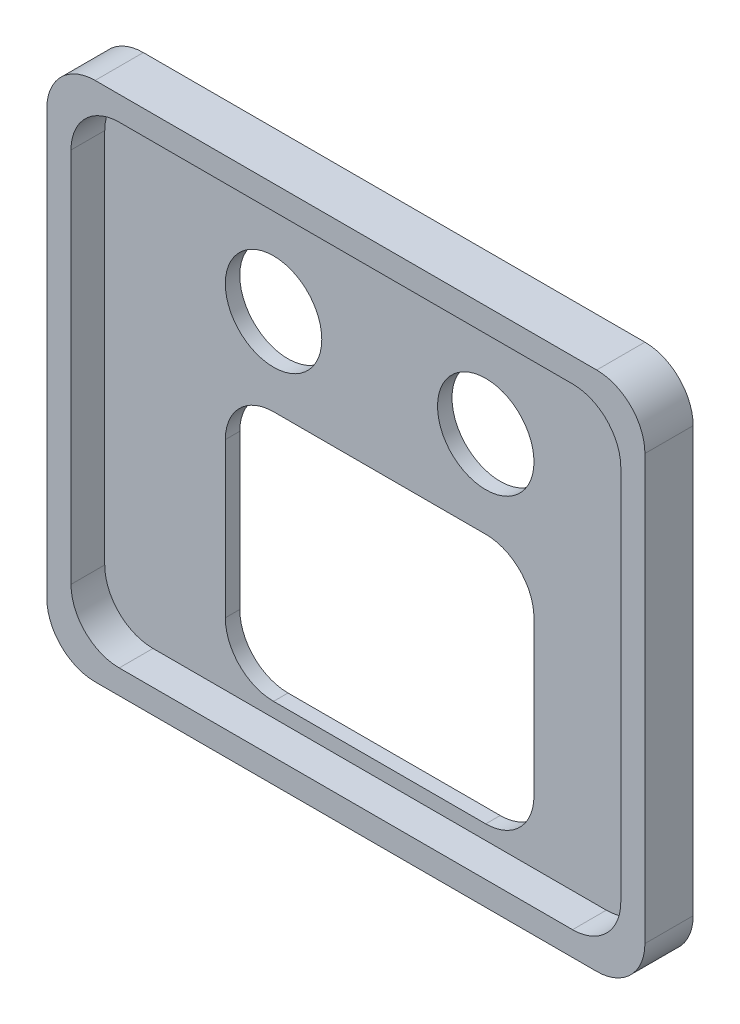
ISO-10303-21;
HEADER;
FILE_DESCRIPTION(('STEP AP214'),'2;1');
FILE_NAME('part.step','',(''),(''),'','','');
FILE_SCHEMA(('AUTOMOTIVE_DESIGN { 1 0 10303 214 1 1 1 1 }'));
ENDSEC;
DATA;
#1=APPLICATION_CONTEXT('core data for automotive mechanical design processes');
#2=APPLICATION_PROTOCOL_DEFINITION('international standard','automotive_design',2000,#1);
#3=PRODUCT_CONTEXT('',#1,'mechanical');
#4=PRODUCT('Part','Part','',(#3));
#5=PRODUCT_RELATED_PRODUCT_CATEGORY('part','',(#4));
#6=PRODUCT_DEFINITION_FORMATION('','',#4);
#7=PRODUCT_DEFINITION_CONTEXT('part definition',#1,'design');
#8=PRODUCT_DEFINITION('design','',#6,#7);
#9=PRODUCT_DEFINITION_SHAPE('','',#8);
#10=(LENGTH_UNIT() NAMED_UNIT(*) SI_UNIT(.MILLI.,.METRE.));
#11=(NAMED_UNIT(*) PLANE_ANGLE_UNIT() SI_UNIT($,.RADIAN.));
#12=(NAMED_UNIT(*) SI_UNIT($,.STERADIAN.) SOLID_ANGLE_UNIT());
#13=UNCERTAINTY_MEASURE_WITH_UNIT(LENGTH_MEASURE(1.E-05),#10,'distance_accuracy_value','');
#14=(GEOMETRIC_REPRESENTATION_CONTEXT(3) GLOBAL_UNCERTAINTY_ASSIGNED_CONTEXT((#13)) GLOBAL_UNIT_ASSIGNED_CONTEXT((#10,
#11,#12)) REPRESENTATION_CONTEXT('',''));
#15=CARTESIAN_POINT('',(0.,0.,0.));
#16=DIRECTION('',(0.,0.,1.));
#17=DIRECTION('',(1.,0.,0.));
#18=AXIS2_PLACEMENT_3D('',#15,#16,#17);
#19=CARTESIAN_POINT('',(10.,10.,10.));
#20=DIRECTION('',(0.,0.,-1.));
#21=DIRECTION('',(-1.,0.,0.));
#22=AXIS2_PLACEMENT_3D('',#19,#20,#21);
#23=CYLINDRICAL_SURFACE('',#22,10.);
#24=CARTESIAN_POINT('',(10.,10.,0.));
#25=DIRECTION('',(0.,0.,1.));
#26=DIRECTION('',(1.,0.,0.));
#27=AXIS2_PLACEMENT_3D('',#24,#25,#26);
#28=CIRCLE('',#27,10.);
#29=CARTESIAN_POINT('',(0.,10.0000000000001,0.));
#30=VERTEX_POINT('',#29);
#31=CARTESIAN_POINT('',(10.0000000000001,0.,0.));
#32=VERTEX_POINT('',#31);
#33=EDGE_CURVE('E302',#30,#32,#28,.T.);
#34=ORIENTED_EDGE('',*,*,#33,.T.);
#35=DIRECTION('',(0.,0.,-1.));
#36=VECTOR('',#35,1.);
#37=CARTESIAN_POINT('',(10.0000000000001,0.,10.));
#38=LINE('',#37,#36);
#39=CARTESIAN_POINT('',(10.0000000000001,0.,10.));
#40=VERTEX_POINT('',#39);
#41=EDGE_CURVE('E367',#40,#32,#38,.T.);
#42=ORIENTED_EDGE('',*,*,#41,.F.);
#43=CARTESIAN_POINT('',(10.,10.,10.));
#44=DIRECTION('',(0.,0.,1.));
#45=DIRECTION('',(1.,0.,0.));
#46=AXIS2_PLACEMENT_3D('',#43,#44,#45);
#47=CIRCLE('',#46,10.);
#48=CARTESIAN_POINT('',(0.,10.0000000000001,10.));
#49=VERTEX_POINT('',#48);
#50=EDGE_CURVE('E316',#49,#40,#47,.T.);
#51=ORIENTED_EDGE('',*,*,#50,.F.);
#52=DIRECTION('',(0.,0.,-1.));
#53=VECTOR('',#52,1.);
#54=CARTESIAN_POINT('',(0.,10.0000000000001,10.));
#55=LINE('',#54,#53);
#56=EDGE_CURVE('E331',#49,#30,#55,.T.);
#57=ORIENTED_EDGE('',*,*,#56,.T.);
#58=EDGE_LOOP('',(#34,#42,#51,#57));
#59=FACE_BOUND('',#58,.T.);
#60=ADVANCED_FACE('F41',(#59),#23,.T.);
#61=CARTESIAN_POINT('',(10.0000000000001,0.,10.));
#62=DIRECTION('',(0.,1.,0.));
#63=DIRECTION('',(0.,0.,1.));
#64=AXIS2_PLACEMENT_3D('',#61,#62,#63);
#65=PLANE('',#64);
#66=DIRECTION('',(1.,0.,0.));
#67=VECTOR('',#66,1.);
#68=CARTESIAN_POINT('',(10.0000000000001,0.,0.));
#69=LINE('',#68,#67);
#70=CARTESIAN_POINT('',(114.,0.,0.));
#71=VERTEX_POINT('',#70);
#72=EDGE_CURVE('E337',#32,#71,#69,.T.);
#73=ORIENTED_EDGE('',*,*,#72,.T.);
#74=DIRECTION('',(0.,0.,-1.));
#75=VECTOR('',#74,1.);
#76=CARTESIAN_POINT('',(114.,0.,10.));
#77=LINE('',#76,#75);
#78=CARTESIAN_POINT('',(114.,0.,10.));
#79=VERTEX_POINT('',#78);
#80=EDGE_CURVE('E370',#79,#71,#77,.T.);
#81=ORIENTED_EDGE('',*,*,#80,.F.);
#82=DIRECTION('',(1.,0.,0.));
#83=VECTOR('',#82,1.);
#84=CARTESIAN_POINT('',(10.0000000000001,0.,10.));
#85=LINE('',#84,#83);
#86=EDGE_CURVE('E317',#40,#79,#85,.T.);
#87=ORIENTED_EDGE('',*,*,#86,.F.);
#88=ORIENTED_EDGE('',*,*,#41,.T.);
#89=EDGE_LOOP('',(#73,#81,#87,#88));
#90=FACE_BOUND('',#89,.T.);
#91=ADVANCED_FACE('F419',(#90),#65,.F.);
#92=CARTESIAN_POINT('',(114.,10.,10.));
#93=DIRECTION('',(0.,0.,-1.));
#94=DIRECTION('',(-1.,0.,0.));
#95=AXIS2_PLACEMENT_3D('',#92,#93,#94);
#96=CYLINDRICAL_SURFACE('',#95,10.);
#97=CARTESIAN_POINT('',(114.,10.,0.));
#98=DIRECTION('',(0.,0.,1.));
#99=DIRECTION('',(-1.,0.,0.));
#100=AXIS2_PLACEMENT_3D('',#97,#98,#99);
#101=CIRCLE('',#100,10.);
#102=CARTESIAN_POINT('',(124.,10.0000000000001,0.));
#103=VERTEX_POINT('',#102);
#104=EDGE_CURVE('E338',#71,#103,#101,.T.);
#105=ORIENTED_EDGE('',*,*,#104,.T.);
#106=DIRECTION('',(0.,0.,-1.));
#107=VECTOR('',#106,1.);
#108=CARTESIAN_POINT('',(124.,10.0000000000001,10.));
#109=LINE('',#108,#107);
#110=CARTESIAN_POINT('',(124.,10.0000000000001,10.));
#111=VERTEX_POINT('',#110);
#112=EDGE_CURVE('E365',#111,#103,#109,.T.);
#113=ORIENTED_EDGE('',*,*,#112,.F.);
#114=CARTESIAN_POINT('',(114.,10.,10.));
#115=DIRECTION('',(0.,0.,1.));
#116=DIRECTION('',(-1.,0.,0.));
#117=AXIS2_PLACEMENT_3D('',#114,#115,#116);
#118=CIRCLE('',#117,10.);
#119=EDGE_CURVE('E325',#79,#111,#118,.T.);
#120=ORIENTED_EDGE('',*,*,#119,.F.);
#121=ORIENTED_EDGE('',*,*,#80,.T.);
#122=EDGE_LOOP('',(#105,#113,#120,#121));
#123=FACE_BOUND('',#122,.T.);
#124=ADVANCED_FACE('F422',(#123),#96,.T.);
#125=CARTESIAN_POINT('',(124.,97.9999999999999,10.));
#126=DIRECTION('',(-1.,0.,0.));
#127=DIRECTION('',(0.,-1.,0.));
#128=AXIS2_PLACEMENT_3D('',#125,#126,#127);
#129=PLANE('',#128);
#130=DIRECTION('',(0.,1.,0.));
#131=VECTOR('',#130,1.);
#132=CARTESIAN_POINT('',(124.,97.9999999999999,0.));
#133=LINE('',#132,#131);
#134=CARTESIAN_POINT('',(124.,97.9999999999999,0.));
#135=VERTEX_POINT('',#134);
#136=EDGE_CURVE('E342',#103,#135,#133,.T.);
#137=ORIENTED_EDGE('',*,*,#136,.T.);
#138=DIRECTION('',(0.,0.,-1.));
#139=VECTOR('',#138,1.);
#140=CARTESIAN_POINT('',(124.,97.9999999999999,10.));
#141=LINE('',#140,#139);
#142=CARTESIAN_POINT('',(124.,97.9999999999999,10.));
#143=VERTEX_POINT('',#142);
#144=EDGE_CURVE('E363',#143,#135,#141,.T.);
#145=ORIENTED_EDGE('',*,*,#144,.F.);
#146=DIRECTION('',(0.,1.,0.));
#147=VECTOR('',#146,1.);
#148=CARTESIAN_POINT('',(124.,97.9999999999999,10.));
#149=LINE('',#148,#147);
#150=EDGE_CURVE('E322',#111,#143,#149,.T.);
#151=ORIENTED_EDGE('',*,*,#150,.F.);
#152=ORIENTED_EDGE('',*,*,#112,.T.);
#153=EDGE_LOOP('',(#137,#145,#151,#152));
#154=FACE_BOUND('',#153,.T.);
#155=ADVANCED_FACE('F460',(#154),#129,.F.);
#156=CARTESIAN_POINT('',(114.,98.,10.));
#157=DIRECTION('',(0.,0.,-1.));
#158=DIRECTION('',(-1.,0.,0.));
#159=AXIS2_PLACEMENT_3D('',#156,#157,#158);
#160=CYLINDRICAL_SURFACE('',#159,9.99999999999999);
#161=CARTESIAN_POINT('',(114.,98.,0.));
#162=DIRECTION('',(0.,0.,1.));
#163=DIRECTION('',(-1.,0.,0.));
#164=AXIS2_PLACEMENT_3D('',#161,#162,#163);
#165=CIRCLE('',#164,9.99999999999999);
#166=CARTESIAN_POINT('',(114.,108.,0.));
#167=VERTEX_POINT('',#166);
#168=EDGE_CURVE('E344',#135,#167,#165,.T.);
#169=ORIENTED_EDGE('',*,*,#168,.T.);
#170=DIRECTION('',(0.,0.,-1.));
#171=VECTOR('',#170,1.);
#172=CARTESIAN_POINT('',(114.,108.,10.));
#173=LINE('',#172,#171);
#174=CARTESIAN_POINT('',(114.,108.,10.));
#175=VERTEX_POINT('',#174);
#176=EDGE_CURVE('E359',#175,#167,#173,.T.);
#177=ORIENTED_EDGE('',*,*,#176,.F.);
#178=CARTESIAN_POINT('',(114.,98.,10.));
#179=DIRECTION('',(0.,0.,1.));
#180=DIRECTION('',(-1.,0.,0.));
#181=AXIS2_PLACEMENT_3D('',#178,#179,#180);
#182=CIRCLE('',#181,9.99999999999999);
#183=EDGE_CURVE('E326',#143,#175,#182,.T.);
#184=ORIENTED_EDGE('',*,*,#183,.F.);
#185=ORIENTED_EDGE('',*,*,#144,.T.);
#186=EDGE_LOOP('',(#169,#177,#184,#185));
#187=FACE_BOUND('',#186,.T.);
#188=ADVANCED_FACE('F454',(#187),#160,.T.);
#189=CARTESIAN_POINT('',(10.0000000000001,108.,10.));
#190=DIRECTION('',(0.,-1.,0.));
#191=DIRECTION('',(0.,0.,-1.));
#192=AXIS2_PLACEMENT_3D('',#189,#190,#191);
#193=PLANE('',#192);
#194=DIRECTION('',(-1.,0.,0.));
#195=VECTOR('',#194,1.);
#196=CARTESIAN_POINT('',(10.0000000000001,108.,0.));
#197=LINE('',#196,#195);
#198=CARTESIAN_POINT('',(10.0000000000001,108.,0.));
#199=VERTEX_POINT('',#198);
#200=EDGE_CURVE('E343',#167,#199,#197,.T.);
#201=ORIENTED_EDGE('',*,*,#200,.T.);
#202=DIRECTION('',(0.,0.,-1.));
#203=VECTOR('',#202,1.);
#204=CARTESIAN_POINT('',(10.0000000000001,108.,10.));
#205=LINE('',#204,#203);
#206=CARTESIAN_POINT('',(10.0000000000001,108.,10.));
#207=VERTEX_POINT('',#206);
#208=EDGE_CURVE('E355',#207,#199,#205,.T.);
#209=ORIENTED_EDGE('',*,*,#208,.F.);
#210=DIRECTION('',(-1.,0.,0.));
#211=VECTOR('',#210,1.);
#212=CARTESIAN_POINT('',(10.0000000000001,108.,10.));
#213=LINE('',#212,#211);
#214=EDGE_CURVE('E327',#175,#207,#213,.T.);
#215=ORIENTED_EDGE('',*,*,#214,.F.);
#216=ORIENTED_EDGE('',*,*,#176,.T.);
#217=EDGE_LOOP('',(#201,#209,#215,#216));
#218=FACE_BOUND('',#217,.T.);
#219=ADVANCED_FACE('F449',(#218),#193,.F.);
#220=CARTESIAN_POINT('',(9.99999999999998,98.,10.));
#221=DIRECTION('',(0.,0.,-1.));
#222=DIRECTION('',(-1.,0.,0.));
#223=AXIS2_PLACEMENT_3D('',#220,#221,#222);
#224=CYLINDRICAL_SURFACE('',#223,9.99999999999999);
#225=CARTESIAN_POINT('',(9.99999999999998,98.,0.));
#226=DIRECTION('',(0.,0.,1.));
#227=DIRECTION('',(1.,0.,0.));
#228=AXIS2_PLACEMENT_3D('',#225,#226,#227);
#229=CIRCLE('',#228,9.99999999999999);
#230=CARTESIAN_POINT('',(0.,97.9999999999999,0.));
#231=VERTEX_POINT('',#230);
#232=EDGE_CURVE('E350',#199,#231,#229,.T.);
#233=ORIENTED_EDGE('',*,*,#232,.T.);
#234=DIRECTION('',(0.,0.,-1.));
#235=VECTOR('',#234,1.);
#236=CARTESIAN_POINT('',(0.,97.9999999999999,10.));
#237=LINE('',#236,#235);
#238=CARTESIAN_POINT('',(0.,97.9999999999999,10.));
#239=VERTEX_POINT('',#238);
#240=EDGE_CURVE('E352',#239,#231,#237,.T.);
#241=ORIENTED_EDGE('',*,*,#240,.F.);
#242=CARTESIAN_POINT('',(9.99999999999998,98.,10.));
#243=DIRECTION('',(0.,0.,1.));
#244=DIRECTION('',(1.,0.,0.));
#245=AXIS2_PLACEMENT_3D('',#242,#243,#244);
#246=CIRCLE('',#245,9.99999999999999);
#247=EDGE_CURVE('E329',#207,#239,#246,.T.);
#248=ORIENTED_EDGE('',*,*,#247,.F.);
#249=ORIENTED_EDGE('',*,*,#208,.T.);
#250=EDGE_LOOP('',(#233,#241,#248,#249));
#251=FACE_BOUND('',#250,.T.);
#252=ADVANCED_FACE('F444',(#251),#224,.T.);
#253=CARTESIAN_POINT('',(0.,97.9999999999999,10.));
#254=DIRECTION('',(1.,0.,0.));
#255=DIRECTION('',(0.,1.,0.));
#256=AXIS2_PLACEMENT_3D('',#253,#254,#255);
#257=PLANE('',#256);
#258=DIRECTION('',(0.,-1.,0.));
#259=VECTOR('',#258,1.);
#260=CARTESIAN_POINT('',(0.,97.9999999999999,0.));
#261=LINE('',#260,#259);
#262=EDGE_CURVE('E319',#231,#30,#261,.T.);
#263=ORIENTED_EDGE('',*,*,#262,.T.);
#264=ORIENTED_EDGE('',*,*,#56,.F.);
#265=DIRECTION('',(0.,-1.,0.));
#266=VECTOR('',#265,1.);
#267=CARTESIAN_POINT('',(0.,97.9999999999999,10.));
#268=LINE('',#267,#266);
#269=EDGE_CURVE('E335',#239,#49,#268,.T.);
#270=ORIENTED_EDGE('',*,*,#269,.F.);
#271=ORIENTED_EDGE('',*,*,#240,.T.);
#272=EDGE_LOOP('',(#263,#264,#270,#271));
#273=FACE_BOUND('',#272,.T.);
#274=ADVANCED_FACE('F413',(#273),#257,.F.);
#275=CARTESIAN_POINT('',(10.,10.,10.));
#276=DIRECTION('',(0.,0.,1.));
#277=DIRECTION('',(1.,0.,0.));
#278=AXIS2_PLACEMENT_3D('',#275,#276,#277);
#279=PLANE('',#278);
#280=CARTESIAN_POINT('',(15.,15.,10.));
#281=DIRECTION('',(0.,0.,1.));
#282=DIRECTION('',(1.,0.,0.));
#283=AXIS2_PLACEMENT_3D('',#280,#281,#282);
#284=CIRCLE('',#283,10.);
#285=CARTESIAN_POINT('',(5.,15.0000000000001,10.));
#286=VERTEX_POINT('',#285);
#287=CARTESIAN_POINT('',(15.0000000000001,5.,10.));
#288=VERTEX_POINT('',#287);
#289=EDGE_CURVE('E241',#286,#288,#284,.T.);
#290=ORIENTED_EDGE('',*,*,#289,.F.);
#291=DIRECTION('',(0.,-1.,0.));
#292=VECTOR('',#291,1.);
#293=CARTESIAN_POINT('',(4.99999999999999,92.9999999999999,10.));
#294=LINE('',#293,#292);
#295=CARTESIAN_POINT('',(4.99999999999999,92.9999999999999,10.));
#296=VERTEX_POINT('',#295);
#297=EDGE_CURVE('E258',#296,#286,#294,.T.);
#298=ORIENTED_EDGE('',*,*,#297,.F.);
#299=CARTESIAN_POINT('',(15.,93.,10.));
#300=DIRECTION('',(0.,0.,1.));
#301=DIRECTION('',(1.,0.,0.));
#302=AXIS2_PLACEMENT_3D('',#299,#300,#301);
#303=CIRCLE('',#302,9.99999999999999);
#304=CARTESIAN_POINT('',(15.0000000000001,103.,10.));
#305=VERTEX_POINT('',#304);
#306=EDGE_CURVE('E294',#305,#296,#303,.T.);
#307=ORIENTED_EDGE('',*,*,#306,.F.);
#308=DIRECTION('',(-1.,0.,0.));
#309=VECTOR('',#308,1.);
#310=CARTESIAN_POINT('',(15.0000000000001,103.,10.));
#311=LINE('',#310,#309);
#312=CARTESIAN_POINT('',(109.,103.,10.));
#313=VERTEX_POINT('',#312);
#314=EDGE_CURVE('E292',#313,#305,#311,.T.);
#315=ORIENTED_EDGE('',*,*,#314,.F.);
#316=CARTESIAN_POINT('',(109.,93.,10.));
#317=DIRECTION('',(0.,0.,1.));
#318=DIRECTION('',(1.,0.,0.));
#319=AXIS2_PLACEMENT_3D('',#316,#317,#318);
#320=CIRCLE('',#319,9.99999999999999);
#321=CARTESIAN_POINT('',(119.,92.9999999999999,10.));
#322=VERTEX_POINT('',#321);
#323=EDGE_CURVE('E289',#322,#313,#320,.T.);
#324=ORIENTED_EDGE('',*,*,#323,.F.);
#325=DIRECTION('',(0.,1.,0.));
#326=VECTOR('',#325,1.);
#327=CARTESIAN_POINT('',(119.,92.9999999999999,10.));
#328=LINE('',#327,#326);
#329=CARTESIAN_POINT('',(119.,15.0000000000001,10.));
#330=VERTEX_POINT('',#329);
#331=EDGE_CURVE('E285',#330,#322,#328,.T.);
#332=ORIENTED_EDGE('',*,*,#331,.F.);
#333=CARTESIAN_POINT('',(109.,15.,10.));
#334=DIRECTION('',(0.,0.,1.));
#335=DIRECTION('',(1.,0.,0.));
#336=AXIS2_PLACEMENT_3D('',#333,#334,#335);
#337=CIRCLE('',#336,10.);
#338=CARTESIAN_POINT('',(109.,5.,10.));
#339=VERTEX_POINT('',#338);
#340=EDGE_CURVE('E282',#339,#330,#337,.T.);
#341=ORIENTED_EDGE('',*,*,#340,.F.);
#342=DIRECTION('',(1.,0.,0.));
#343=VECTOR('',#342,1.);
#344=CARTESIAN_POINT('',(15.0000000000001,5.,10.));
#345=LINE('',#344,#343);
#346=EDGE_CURVE('E276',#288,#339,#345,.T.);
#347=ORIENTED_EDGE('',*,*,#346,.F.);
#348=EDGE_LOOP('',(#290,#298,#307,#315,#324,#332,#341,#347));
#349=FACE_BOUND('',#348,.T.);
#350=ORIENTED_EDGE('',*,*,#50,.T.);
#351=ORIENTED_EDGE('',*,*,#86,.T.);
#352=ORIENTED_EDGE('',*,*,#119,.T.);
#353=ORIENTED_EDGE('',*,*,#150,.T.);
#354=ORIENTED_EDGE('',*,*,#183,.T.);
#355=ORIENTED_EDGE('',*,*,#214,.T.);
#356=ORIENTED_EDGE('',*,*,#247,.T.);
#357=ORIENTED_EDGE('',*,*,#269,.T.);
#358=EDGE_LOOP('',(#350,#351,#352,#353,#354,#355,#356,#357));
#359=FACE_BOUND('',#358,.T.);
#360=ADVANCED_FACE('F401',(#349,#359),#279,.T.);
#361=CARTESIAN_POINT('',(10.,10.,0.));
#362=DIRECTION('',(0.,0.,1.));
#363=DIRECTION('',(1.,0.,0.));
#364=AXIS2_PLACEMENT_3D('',#361,#362,#363);
#365=PLANE('',#364);
#366=CARTESIAN_POINT('',(84.,78.,0.));
#367=DIRECTION('',(0.,0.,-1.));
#368=DIRECTION('',(-1.,0.,0.));
#369=AXIS2_PLACEMENT_3D('',#366,#367,#368);
#370=CIRCLE('',#369,9.99999999999999);
#371=CARTESIAN_POINT('',(74.,78.,0.));
#372=VERTEX_POINT('',#371);
#373=EDGE_CURVE('E387',#372,#372,#370,.T.);
#374=ORIENTED_EDGE('',*,*,#373,.F.);
#375=EDGE_LOOP('',(#374));
#376=FACE_BOUND('',#375,.T.);
#377=CARTESIAN_POINT('',(40.,78.,0.));
#378=DIRECTION('',(0.,0.,-1.));
#379=DIRECTION('',(-1.,0.,0.));
#380=AXIS2_PLACEMENT_3D('',#377,#378,#379);
#381=CIRCLE('',#380,9.99999999999999);
#382=CARTESIAN_POINT('',(30.,78.,0.));
#383=VERTEX_POINT('',#382);
#384=EDGE_CURVE('E391',#383,#383,#381,.T.);
#385=ORIENTED_EDGE('',*,*,#384,.F.);
#386=EDGE_LOOP('',(#385));
#387=FACE_BOUND('',#386,.T.);
#388=DIRECTION('',(-1.,0.,0.));
#389=VECTOR('',#388,1.);
#390=CARTESIAN_POINT('',(83.9999999999999,8.,0.));
#391=LINE('',#390,#389);
#392=CARTESIAN_POINT('',(83.9999999999999,8.,0.));
#393=VERTEX_POINT('',#392);
#394=CARTESIAN_POINT('',(40.,8.,0.));
#395=VERTEX_POINT('',#394);
#396=EDGE_CURVE('E212',#393,#395,#391,.T.);
#397=ORIENTED_EDGE('',*,*,#396,.F.);
#398=CARTESIAN_POINT('',(84.,18.,0.));
#399=DIRECTION('',(0.,0.,-1.));
#400=DIRECTION('',(1.,0.,0.));
#401=AXIS2_PLACEMENT_3D('',#398,#399,#400);
#402=CIRCLE('',#401,10.);
#403=CARTESIAN_POINT('',(94.,18.0000000000001,0.));
#404=VERTEX_POINT('',#403);
#405=EDGE_CURVE('E60',#404,#393,#402,.T.);
#406=ORIENTED_EDGE('',*,*,#405,.F.);
#407=DIRECTION('',(0.,-1.,0.));
#408=VECTOR('',#407,1.);
#409=CARTESIAN_POINT('',(94.,49.9999999999999,0.));
#410=LINE('',#409,#408);
#411=CARTESIAN_POINT('',(94.,49.9999999999999,0.));
#412=VERTEX_POINT('',#411);
#413=EDGE_CURVE('E237',#412,#404,#410,.T.);
#414=ORIENTED_EDGE('',*,*,#413,.F.);
#415=CARTESIAN_POINT('',(84.,50.,0.));
#416=DIRECTION('',(0.,0.,-1.));
#417=DIRECTION('',(-1.,0.,0.));
#418=AXIS2_PLACEMENT_3D('',#415,#416,#417);
#419=CIRCLE('',#418,9.99999999999999);
#420=CARTESIAN_POINT('',(83.9999999999999,60.,0.));
#421=VERTEX_POINT('',#420);
#422=EDGE_CURVE('E234',#421,#412,#419,.T.);
#423=ORIENTED_EDGE('',*,*,#422,.F.);
#424=DIRECTION('',(1.,0.,0.));
#425=VECTOR('',#424,1.);
#426=CARTESIAN_POINT('',(83.9999999999999,60.,0.));
#427=LINE('',#426,#425);
#428=CARTESIAN_POINT('',(40.0000000000001,60.,0.));
#429=VERTEX_POINT('',#428);
#430=EDGE_CURVE('E230',#429,#421,#427,.T.);
#431=ORIENTED_EDGE('',*,*,#430,.F.);
#432=CARTESIAN_POINT('',(40.,50.,0.));
#433=DIRECTION('',(0.,0.,-1.));
#434=DIRECTION('',(-1.,0.,0.));
#435=AXIS2_PLACEMENT_3D('',#432,#433,#434);
#436=CIRCLE('',#435,10.);
#437=CARTESIAN_POINT('',(30.,49.9999999999999,0.));
#438=VERTEX_POINT('',#437);
#439=EDGE_CURVE('E221',#438,#429,#436,.T.);
#440=ORIENTED_EDGE('',*,*,#439,.F.);
#441=DIRECTION('',(0.,1.,0.));
#442=VECTOR('',#441,1.);
#443=CARTESIAN_POINT('',(30.,49.9999999999999,0.));
#444=LINE('',#443,#442);
#445=CARTESIAN_POINT('',(30.,18.0000000000001,0.));
#446=VERTEX_POINT('',#445);
#447=EDGE_CURVE('E225',#446,#438,#444,.T.);
#448=ORIENTED_EDGE('',*,*,#447,.F.);
#449=CARTESIAN_POINT('',(40.,18.,0.));
#450=DIRECTION('',(0.,0.,-1.));
#451=DIRECTION('',(1.,0.,0.));
#452=AXIS2_PLACEMENT_3D('',#449,#450,#451);
#453=CIRCLE('',#452,10.);
#454=EDGE_CURVE('E202',#395,#446,#453,.T.);
#455=ORIENTED_EDGE('',*,*,#454,.F.);
#456=EDGE_LOOP('',(#397,#406,#414,#423,#431,#440,#448,#455));
#457=FACE_BOUND('',#456,.T.);
#458=ORIENTED_EDGE('',*,*,#33,.F.);
#459=ORIENTED_EDGE('',*,*,#262,.F.);
#460=ORIENTED_EDGE('',*,*,#232,.F.);
#461=ORIENTED_EDGE('',*,*,#200,.F.);
#462=ORIENTED_EDGE('',*,*,#168,.F.);
#463=ORIENTED_EDGE('',*,*,#136,.F.);
#464=ORIENTED_EDGE('',*,*,#104,.F.);
#465=ORIENTED_EDGE('',*,*,#72,.F.);
#466=EDGE_LOOP('',(#458,#459,#460,#461,#462,#463,#464,#465));
#467=FACE_BOUND('',#466,.T.);
#468=ADVANCED_FACE('F217',(#376,#387,#457,#467),#365,.F.);
#469=CARTESIAN_POINT('',(15.,15.,3.));
#470=DIRECTION('',(0.,0.,1.));
#471=DIRECTION('',(1.,0.,0.));
#472=AXIS2_PLACEMENT_3D('',#469,#470,#471);
#473=CYLINDRICAL_SURFACE('',#472,10.);
#474=ORIENTED_EDGE('',*,*,#289,.T.);
#475=DIRECTION('',(0.,0.,1.));
#476=VECTOR('',#475,1.);
#477=CARTESIAN_POINT('',(15.0000000000001,5.,3.));
#478=LINE('',#477,#476);
#479=CARTESIAN_POINT('',(15.0000000000001,5.,3.));
#480=VERTEX_POINT('',#479);
#481=EDGE_CURVE('E280',#480,#288,#478,.T.);
#482=ORIENTED_EDGE('',*,*,#481,.F.);
#483=CARTESIAN_POINT('',(15.,15.,3.));
#484=DIRECTION('',(0.,0.,1.));
#485=DIRECTION('',(1.,0.,0.));
#486=AXIS2_PLACEMENT_3D('',#483,#484,#485);
#487=CIRCLE('',#486,10.);
#488=CARTESIAN_POINT('',(5.,15.0000000000001,3.));
#489=VERTEX_POINT('',#488);
#490=EDGE_CURVE('E252',#489,#480,#487,.T.);
#491=ORIENTED_EDGE('',*,*,#490,.F.);
#492=DIRECTION('',(0.,0.,1.));
#493=VECTOR('',#492,1.);
#494=CARTESIAN_POINT('',(5.,15.0000000000001,3.));
#495=LINE('',#494,#493);
#496=EDGE_CURVE('E298',#489,#286,#495,.T.);
#497=ORIENTED_EDGE('',*,*,#496,.T.);
#498=EDGE_LOOP('',(#474,#482,#491,#497));
#499=FACE_BOUND('',#498,.T.);
#500=ADVANCED_FACE('F405',(#499),#473,.F.);
#501=CARTESIAN_POINT('',(4.99999999999999,92.9999999999999,3.));
#502=DIRECTION('',(-1.,0.,0.));
#503=DIRECTION('',(0.,-1.,0.));
#504=AXIS2_PLACEMENT_3D('',#501,#502,#503);
#505=PLANE('',#504);
#506=ORIENTED_EDGE('',*,*,#297,.T.);
#507=ORIENTED_EDGE('',*,*,#496,.F.);
#508=DIRECTION('',(0.,-1.,0.));
#509=VECTOR('',#508,1.);
#510=CARTESIAN_POINT('',(4.99999999999999,92.9999999999999,3.));
#511=LINE('',#510,#509);
#512=CARTESIAN_POINT('',(4.99999999999999,92.9999999999999,3.));
#513=VERTEX_POINT('',#512);
#514=EDGE_CURVE('E273',#513,#489,#511,.T.);
#515=ORIENTED_EDGE('',*,*,#514,.F.);
#516=DIRECTION('',(0.,0.,1.));
#517=VECTOR('',#516,1.);
#518=CARTESIAN_POINT('',(4.99999999999999,92.9999999999999,3.));
#519=LINE('',#518,#517);
#520=EDGE_CURVE('E305',#513,#296,#519,.T.);
#521=ORIENTED_EDGE('',*,*,#520,.T.);
#522=EDGE_LOOP('',(#506,#507,#515,#521));
#523=FACE_BOUND('',#522,.T.);
#524=ADVANCED_FACE('F412',(#523),#505,.F.);
#525=CARTESIAN_POINT('',(15.,93.,3.));
#526=DIRECTION('',(0.,0.,1.));
#527=DIRECTION('',(1.,0.,0.));
#528=AXIS2_PLACEMENT_3D('',#525,#526,#527);
#529=CYLINDRICAL_SURFACE('',#528,9.99999999999999);
#530=ORIENTED_EDGE('',*,*,#306,.T.);
#531=ORIENTED_EDGE('',*,*,#520,.F.);
#532=CARTESIAN_POINT('',(15.,93.,3.));
#533=DIRECTION('',(0.,0.,1.));
#534=DIRECTION('',(1.,0.,0.));
#535=AXIS2_PLACEMENT_3D('',#532,#533,#534);
#536=CIRCLE('',#535,9.99999999999999);
#537=CARTESIAN_POINT('',(15.0000000000001,103.,3.));
#538=VERTEX_POINT('',#537);
#539=EDGE_CURVE('E271',#538,#513,#536,.T.);
#540=ORIENTED_EDGE('',*,*,#539,.F.);
#541=DIRECTION('',(0.,0.,1.));
#542=VECTOR('',#541,1.);
#543=CARTESIAN_POINT('',(15.0000000000001,103.,3.));
#544=LINE('',#543,#542);
#545=EDGE_CURVE('E301',#538,#305,#544,.T.);
#546=ORIENTED_EDGE('',*,*,#545,.T.);
#547=EDGE_LOOP('',(#530,#531,#540,#546));
#548=FACE_BOUND('',#547,.T.);
#549=ADVANCED_FACE('F493',(#548),#529,.F.);
#550=CARTESIAN_POINT('',(15.0000000000001,103.,3.));
#551=DIRECTION('',(0.,1.,0.));
#552=DIRECTION('',(0.,0.,1.));
#553=AXIS2_PLACEMENT_3D('',#550,#551,#552);
#554=PLANE('',#553);
#555=ORIENTED_EDGE('',*,*,#314,.T.);
#556=ORIENTED_EDGE('',*,*,#545,.F.);
#557=DIRECTION('',(-1.,0.,0.));
#558=VECTOR('',#557,1.);
#559=CARTESIAN_POINT('',(15.0000000000001,103.,3.));
#560=LINE('',#559,#558);
#561=CARTESIAN_POINT('',(109.,103.,3.));
#562=VERTEX_POINT('',#561);
#563=EDGE_CURVE('E268',#562,#538,#560,.T.);
#564=ORIENTED_EDGE('',*,*,#563,.F.);
#565=DIRECTION('',(0.,0.,1.));
#566=VECTOR('',#565,1.);
#567=CARTESIAN_POINT('',(109.,103.,3.));
#568=LINE('',#567,#566);
#569=EDGE_CURVE('E308',#562,#313,#568,.T.);
#570=ORIENTED_EDGE('',*,*,#569,.T.);
#571=EDGE_LOOP('',(#555,#556,#564,#570));
#572=FACE_BOUND('',#571,.T.);
#573=ADVANCED_FACE('F504',(#572),#554,.F.);
#574=CARTESIAN_POINT('',(109.,93.,3.));
#575=DIRECTION('',(0.,0.,1.));
#576=DIRECTION('',(1.,0.,0.));
#577=AXIS2_PLACEMENT_3D('',#574,#575,#576);
#578=CYLINDRICAL_SURFACE('',#577,9.99999999999999);
#579=ORIENTED_EDGE('',*,*,#323,.T.);
#580=ORIENTED_EDGE('',*,*,#569,.F.);
#581=CARTESIAN_POINT('',(109.,93.,3.));
#582=DIRECTION('',(0.,0.,1.));
#583=DIRECTION('',(1.,0.,0.));
#584=AXIS2_PLACEMENT_3D('',#581,#582,#583);
#585=CIRCLE('',#584,9.99999999999999);
#586=CARTESIAN_POINT('',(119.,92.9999999999999,3.));
#587=VERTEX_POINT('',#586);
#588=EDGE_CURVE('E264',#587,#562,#585,.T.);
#589=ORIENTED_EDGE('',*,*,#588,.F.);
#590=DIRECTION('',(0.,0.,1.));
#591=VECTOR('',#590,1.);
#592=CARTESIAN_POINT('',(119.,92.9999999999999,3.));
#593=LINE('',#592,#591);
#594=EDGE_CURVE('E306',#587,#322,#593,.T.);
#595=ORIENTED_EDGE('',*,*,#594,.T.);
#596=EDGE_LOOP('',(#579,#580,#589,#595));
#597=FACE_BOUND('',#596,.T.);
#598=ADVANCED_FACE('F515',(#597),#578,.F.);
#599=CARTESIAN_POINT('',(119.,92.9999999999999,3.));
#600=DIRECTION('',(1.,0.,0.));
#601=DIRECTION('',(0.,1.,0.));
#602=AXIS2_PLACEMENT_3D('',#599,#600,#601);
#603=PLANE('',#602);
#604=ORIENTED_EDGE('',*,*,#331,.T.);
#605=ORIENTED_EDGE('',*,*,#594,.F.);
#606=DIRECTION('',(0.,1.,0.));
#607=VECTOR('',#606,1.);
#608=CARTESIAN_POINT('',(119.,92.9999999999999,3.));
#609=LINE('',#608,#607);
#610=CARTESIAN_POINT('',(119.,15.0000000000001,3.));
#611=VERTEX_POINT('',#610);
#612=EDGE_CURVE('E265',#611,#587,#609,.T.);
#613=ORIENTED_EDGE('',*,*,#612,.F.);
#614=DIRECTION('',(0.,0.,1.));
#615=VECTOR('',#614,1.);
#616=CARTESIAN_POINT('',(119.,15.0000000000001,3.));
#617=LINE('',#616,#615);
#618=EDGE_CURVE('E309',#611,#330,#617,.T.);
#619=ORIENTED_EDGE('',*,*,#618,.T.);
#620=EDGE_LOOP('',(#604,#605,#613,#619));
#621=FACE_BOUND('',#620,.T.);
#622=ADVANCED_FACE('F522',(#621),#603,.F.);
#623=CARTESIAN_POINT('',(109.,15.,3.));
#624=DIRECTION('',(0.,0.,1.));
#625=DIRECTION('',(1.,0.,0.));
#626=AXIS2_PLACEMENT_3D('',#623,#624,#625);
#627=CYLINDRICAL_SURFACE('',#626,10.);
#628=ORIENTED_EDGE('',*,*,#340,.T.);
#629=ORIENTED_EDGE('',*,*,#618,.F.);
#630=CARTESIAN_POINT('',(109.,15.,3.));
#631=DIRECTION('',(0.,0.,1.));
#632=DIRECTION('',(1.,0.,0.));
#633=AXIS2_PLACEMENT_3D('',#630,#631,#632);
#634=CIRCLE('',#633,10.);
#635=CARTESIAN_POINT('',(109.,5.,3.));
#636=VERTEX_POINT('',#635);
#637=EDGE_CURVE('E259',#636,#611,#634,.T.);
#638=ORIENTED_EDGE('',*,*,#637,.F.);
#639=DIRECTION('',(0.,0.,1.));
#640=VECTOR('',#639,1.);
#641=CARTESIAN_POINT('',(109.,5.,3.));
#642=LINE('',#641,#640);
#643=EDGE_CURVE('E315',#636,#339,#642,.T.);
#644=ORIENTED_EDGE('',*,*,#643,.T.);
#645=EDGE_LOOP('',(#628,#629,#638,#644));
#646=FACE_BOUND('',#645,.T.);
#647=ADVANCED_FACE('F529',(#646),#627,.F.);
#648=CARTESIAN_POINT('',(15.0000000000001,5.,3.));
#649=DIRECTION('',(0.,-1.,0.));
#650=DIRECTION('',(0.,0.,-1.));
#651=AXIS2_PLACEMENT_3D('',#648,#649,#650);
#652=PLANE('',#651);
#653=ORIENTED_EDGE('',*,*,#346,.T.);
#654=ORIENTED_EDGE('',*,*,#643,.F.);
#655=DIRECTION('',(1.,0.,0.));
#656=VECTOR('',#655,1.);
#657=CARTESIAN_POINT('',(15.0000000000001,5.,3.));
#658=LINE('',#657,#656);
#659=EDGE_CURVE('E254',#480,#636,#658,.T.);
#660=ORIENTED_EDGE('',*,*,#659,.F.);
#661=ORIENTED_EDGE('',*,*,#481,.T.);
#662=EDGE_LOOP('',(#653,#654,#660,#661));
#663=FACE_BOUND('',#662,.T.);
#664=ADVANCED_FACE('F537',(#663),#652,.F.);
#665=CARTESIAN_POINT('',(15.,15.,3.));
#666=DIRECTION('',(0.,0.,1.));
#667=DIRECTION('',(1.,0.,0.));
#668=AXIS2_PLACEMENT_3D('',#665,#666,#667);
#669=PLANE('',#668);
#670=CARTESIAN_POINT('',(84.,78.,3.));
#671=DIRECTION('',(0.,0.,1.));
#672=DIRECTION('',(1.,0.,0.));
#673=AXIS2_PLACEMENT_3D('',#670,#671,#672);
#674=CIRCLE('',#673,9.99999999999999);
#675=CARTESIAN_POINT('',(94.,78.,3.));
#676=VERTEX_POINT('',#675);
#677=EDGE_CURVE('E42',#676,#676,#674,.T.);
#678=ORIENTED_EDGE('',*,*,#677,.F.);
#679=EDGE_LOOP('',(#678));
#680=FACE_BOUND('',#679,.T.);
#681=CARTESIAN_POINT('',(40.,78.,3.));
#682=DIRECTION('',(0.,0.,1.));
#683=DIRECTION('',(1.,0.,0.));
#684=AXIS2_PLACEMENT_3D('',#681,#682,#683);
#685=CIRCLE('',#684,9.99999999999999);
#686=CARTESIAN_POINT('',(50.,78.,3.));
#687=VERTEX_POINT('',#686);
#688=EDGE_CURVE('E383',#687,#687,#685,.T.);
#689=ORIENTED_EDGE('',*,*,#688,.F.);
#690=EDGE_LOOP('',(#689));
#691=FACE_BOUND('',#690,.T.);
#692=CARTESIAN_POINT('',(84.,18.,3.));
#693=DIRECTION('',(0.,0.,1.));
#694=DIRECTION('',(1.,0.,0.));
#695=AXIS2_PLACEMENT_3D('',#692,#693,#694);
#696=CIRCLE('',#695,10.);
#697=CARTESIAN_POINT('',(83.9999999999999,8.,3.));
#698=VERTEX_POINT('',#697);
#699=CARTESIAN_POINT('',(94.,18.0000000000001,3.));
#700=VERTEX_POINT('',#699);
#701=EDGE_CURVE('E11',#698,#700,#696,.T.);
#702=ORIENTED_EDGE('',*,*,#701,.F.);
#703=DIRECTION('',(1.,0.,0.));
#704=VECTOR('',#703,1.);
#705=CARTESIAN_POINT('',(15.,8.,3.));
#706=LINE('',#705,#704);
#707=CARTESIAN_POINT('',(40.,8.,3.));
#708=VERTEX_POINT('',#707);
#709=EDGE_CURVE('E373',#708,#698,#706,.T.);
#710=ORIENTED_EDGE('',*,*,#709,.F.);
#711=CARTESIAN_POINT('',(40.,18.,3.));
#712=DIRECTION('',(0.,0.,1.));
#713=DIRECTION('',(1.,0.,0.));
#714=AXIS2_PLACEMENT_3D('',#711,#712,#713);
#715=CIRCLE('',#714,10.);
#716=CARTESIAN_POINT('',(30.,18.0000000000001,3.));
#717=VERTEX_POINT('',#716);
#718=EDGE_CURVE('E208',#717,#708,#715,.T.);
#719=ORIENTED_EDGE('',*,*,#718,.F.);
#720=DIRECTION('',(0.,-1.,0.));
#721=VECTOR('',#720,1.);
#722=CARTESIAN_POINT('',(30.,15.,3.));
#723=LINE('',#722,#721);
#724=CARTESIAN_POINT('',(30.,49.9999999999999,3.));
#725=VERTEX_POINT('',#724);
#726=EDGE_CURVE('E376',#725,#717,#723,.T.);
#727=ORIENTED_EDGE('',*,*,#726,.F.);
#728=CARTESIAN_POINT('',(40.,50.,3.));
#729=DIRECTION('',(0.,0.,1.));
#730=DIRECTION('',(1.,0.,0.));
#731=AXIS2_PLACEMENT_3D('',#728,#729,#730);
#732=CIRCLE('',#731,10.);
#733=CARTESIAN_POINT('',(40.0000000000001,60.,3.));
#734=VERTEX_POINT('',#733);
#735=EDGE_CURVE('E378',#734,#725,#732,.T.);
#736=ORIENTED_EDGE('',*,*,#735,.F.);
#737=DIRECTION('',(-1.,0.,0.));
#738=VECTOR('',#737,1.);
#739=CARTESIAN_POINT('',(15.,60.,3.));
#740=LINE('',#739,#738);
#741=CARTESIAN_POINT('',(83.9999999999999,60.,3.));
#742=VERTEX_POINT('',#741);
#743=EDGE_CURVE('E379',#742,#734,#740,.T.);
#744=ORIENTED_EDGE('',*,*,#743,.F.);
#745=CARTESIAN_POINT('',(84.,50.,3.));
#746=DIRECTION('',(0.,0.,1.));
#747=DIRECTION('',(1.,0.,0.));
#748=AXIS2_PLACEMENT_3D('',#745,#746,#747);
#749=CIRCLE('',#748,9.99999999999999);
#750=CARTESIAN_POINT('',(94.,49.9999999999999,3.));
#751=VERTEX_POINT('',#750);
#752=EDGE_CURVE('E385',#751,#742,#749,.T.);
#753=ORIENTED_EDGE('',*,*,#752,.F.);
#754=DIRECTION('',(0.,1.,0.));
#755=VECTOR('',#754,1.);
#756=CARTESIAN_POINT('',(94.,15.,3.));
#757=LINE('',#756,#755);
#758=EDGE_CURVE('E47',#700,#751,#757,.T.);
#759=ORIENTED_EDGE('',*,*,#758,.F.);
#760=EDGE_LOOP('',(#702,#710,#719,#727,#736,#744,#753,#759));
#761=FACE_BOUND('',#760,.T.);
#762=ORIENTED_EDGE('',*,*,#490,.T.);
#763=ORIENTED_EDGE('',*,*,#659,.T.);
#764=ORIENTED_EDGE('',*,*,#637,.T.);
#765=ORIENTED_EDGE('',*,*,#612,.T.);
#766=ORIENTED_EDGE('',*,*,#588,.T.);
#767=ORIENTED_EDGE('',*,*,#563,.T.);
#768=ORIENTED_EDGE('',*,*,#539,.T.);
#769=ORIENTED_EDGE('',*,*,#514,.T.);
#770=EDGE_LOOP('',(#762,#763,#764,#765,#766,#767,#768,#769));
#771=FACE_BOUND('',#770,.T.);
#772=ADVANCED_FACE('F547',(#680,#691,#761,#771),#669,.T.);
#773=CARTESIAN_POINT('',(84.,18.,7.));
#774=DIRECTION('',(0.,0.,-1.));
#775=DIRECTION('',(-1.,0.,0.));
#776=AXIS2_PLACEMENT_3D('',#773,#774,#775);
#777=CYLINDRICAL_SURFACE('',#776,10.);
#778=ORIENTED_EDGE('',*,*,#701,.T.);
#779=DIRECTION('',(0.,0.,-1.));
#780=VECTOR('',#779,1.);
#781=CARTESIAN_POINT('',(94.,18.0000000000001,7.));
#782=LINE('',#781,#780);
#783=EDGE_CURVE('E239',#700,#404,#782,.T.);
#784=ORIENTED_EDGE('',*,*,#783,.T.);
#785=ORIENTED_EDGE('',*,*,#405,.T.);
#786=DIRECTION('',(0.,0.,-1.));
#787=VECTOR('',#786,1.);
#788=CARTESIAN_POINT('',(83.9999999999999,8.,7.));
#789=LINE('',#788,#787);
#790=EDGE_CURVE('E211',#698,#393,#789,.T.);
#791=ORIENTED_EDGE('',*,*,#790,.F.);
#792=EDGE_LOOP('',(#778,#784,#785,#791));
#793=FACE_BOUND('',#792,.T.);
#794=ADVANCED_FACE('F553',(#793),#777,.F.);
#795=CARTESIAN_POINT('',(94.,49.9999999999999,7.));
#796=DIRECTION('',(1.,0.,0.));
#797=DIRECTION('',(0.,0.,-1.));
#798=AXIS2_PLACEMENT_3D('',#795,#796,#797);
#799=PLANE('',#798);
#800=ORIENTED_EDGE('',*,*,#758,.T.);
#801=DIRECTION('',(0.,0.,-1.));
#802=VECTOR('',#801,1.);
#803=CARTESIAN_POINT('',(94.,49.9999999999999,7.));
#804=LINE('',#803,#802);
#805=EDGE_CURVE('E242',#751,#412,#804,.T.);
#806=ORIENTED_EDGE('',*,*,#805,.T.);
#807=ORIENTED_EDGE('',*,*,#413,.T.);
#808=ORIENTED_EDGE('',*,*,#783,.F.);
#809=EDGE_LOOP('',(#800,#806,#807,#808));
#810=FACE_BOUND('',#809,.T.);
#811=ADVANCED_FACE('F558',(#810),#799,.F.);
#812=CARTESIAN_POINT('',(84.,50.,7.));
#813=DIRECTION('',(0.,0.,-1.));
#814=DIRECTION('',(-1.,0.,0.));
#815=AXIS2_PLACEMENT_3D('',#812,#813,#814);
#816=CYLINDRICAL_SURFACE('',#815,9.99999999999999);
#817=ORIENTED_EDGE('',*,*,#752,.T.);
#818=DIRECTION('',(0.,0.,-1.));
#819=VECTOR('',#818,1.);
#820=CARTESIAN_POINT('',(83.9999999999999,60.,7.));
#821=LINE('',#820,#819);
#822=EDGE_CURVE('E243',#742,#421,#821,.T.);
#823=ORIENTED_EDGE('',*,*,#822,.T.);
#824=ORIENTED_EDGE('',*,*,#422,.T.);
#825=ORIENTED_EDGE('',*,*,#805,.F.);
#826=EDGE_LOOP('',(#817,#823,#824,#825));
#827=FACE_BOUND('',#826,.T.);
#828=ADVANCED_FACE('F570',(#827),#816,.F.);
#829=CARTESIAN_POINT('',(83.9999999999999,60.,7.));
#830=DIRECTION('',(0.,1.,0.));
#831=DIRECTION('',(0.,0.,1.));
#832=AXIS2_PLACEMENT_3D('',#829,#830,#831);
#833=PLANE('',#832);
#834=ORIENTED_EDGE('',*,*,#743,.T.);
#835=DIRECTION('',(0.,0.,-1.));
#836=VECTOR('',#835,1.);
#837=CARTESIAN_POINT('',(40.0000000000001,60.,7.));
#838=LINE('',#837,#836);
#839=EDGE_CURVE('E247',#734,#429,#838,.T.);
#840=ORIENTED_EDGE('',*,*,#839,.T.);
#841=ORIENTED_EDGE('',*,*,#430,.T.);
#842=ORIENTED_EDGE('',*,*,#822,.F.);
#843=EDGE_LOOP('',(#834,#840,#841,#842));
#844=FACE_BOUND('',#843,.T.);
#845=ADVANCED_FACE('F577',(#844),#833,.F.);
#846=CARTESIAN_POINT('',(40.,50.,7.));
#847=DIRECTION('',(0.,0.,-1.));
#848=DIRECTION('',(-1.,0.,0.));
#849=AXIS2_PLACEMENT_3D('',#846,#847,#848);
#850=CYLINDRICAL_SURFACE('',#849,10.);
#851=ORIENTED_EDGE('',*,*,#735,.T.);
#852=DIRECTION('',(0.,0.,-1.));
#853=VECTOR('',#852,1.);
#854=CARTESIAN_POINT('',(30.,49.9999999999999,7.));
#855=LINE('',#854,#853);
#856=EDGE_CURVE('E249',#725,#438,#855,.T.);
#857=ORIENTED_EDGE('',*,*,#856,.T.);
#858=ORIENTED_EDGE('',*,*,#439,.T.);
#859=ORIENTED_EDGE('',*,*,#839,.F.);
#860=EDGE_LOOP('',(#851,#857,#858,#859));
#861=FACE_BOUND('',#860,.T.);
#862=ADVANCED_FACE('F584',(#861),#850,.F.);
#863=CARTESIAN_POINT('',(30.,49.9999999999999,7.));
#864=DIRECTION('',(-1.,0.,0.));
#865=DIRECTION('',(0.,-1.,0.));
#866=AXIS2_PLACEMENT_3D('',#863,#864,#865);
#867=PLANE('',#866);
#868=ORIENTED_EDGE('',*,*,#726,.T.);
#869=DIRECTION('',(0.,0.,-1.));
#870=VECTOR('',#869,1.);
#871=CARTESIAN_POINT('',(30.,18.0000000000001,7.));
#872=LINE('',#871,#870);
#873=EDGE_CURVE('E209',#717,#446,#872,.T.);
#874=ORIENTED_EDGE('',*,*,#873,.T.);
#875=ORIENTED_EDGE('',*,*,#447,.T.);
#876=ORIENTED_EDGE('',*,*,#856,.F.);
#877=EDGE_LOOP('',(#868,#874,#875,#876));
#878=FACE_BOUND('',#877,.T.);
#879=ADVANCED_FACE('F592',(#878),#867,.F.);
#880=CARTESIAN_POINT('',(40.,18.,7.));
#881=DIRECTION('',(0.,0.,-1.));
#882=DIRECTION('',(-1.,0.,0.));
#883=AXIS2_PLACEMENT_3D('',#880,#881,#882);
#884=CYLINDRICAL_SURFACE('',#883,10.);
#885=ORIENTED_EDGE('',*,*,#718,.T.);
#886=DIRECTION('',(0.,0.,-1.));
#887=VECTOR('',#886,1.);
#888=CARTESIAN_POINT('',(40.,8.,7.));
#889=LINE('',#888,#887);
#890=EDGE_CURVE('E65',#708,#395,#889,.T.);
#891=ORIENTED_EDGE('',*,*,#890,.T.);
#892=ORIENTED_EDGE('',*,*,#454,.T.);
#893=ORIENTED_EDGE('',*,*,#873,.F.);
#894=EDGE_LOOP('',(#885,#891,#892,#893));
#895=FACE_BOUND('',#894,.T.);
#896=ADVANCED_FACE('F205',(#895),#884,.F.);
#897=CARTESIAN_POINT('',(83.9999999999999,8.,7.));
#898=DIRECTION('',(0.,-1.,0.));
#899=DIRECTION('',(0.,0.,-1.));
#900=AXIS2_PLACEMENT_3D('',#897,#898,#899);
#901=PLANE('',#900);
#902=ORIENTED_EDGE('',*,*,#709,.T.);
#903=ORIENTED_EDGE('',*,*,#790,.T.);
#904=ORIENTED_EDGE('',*,*,#396,.T.);
#905=ORIENTED_EDGE('',*,*,#890,.F.);
#906=EDGE_LOOP('',(#902,#903,#904,#905));
#907=FACE_BOUND('',#906,.T.);
#908=ADVANCED_FACE('F214',(#907),#901,.F.);
#909=CARTESIAN_POINT('',(40.,78.,7.));
#910=DIRECTION('',(0.,0.,-1.));
#911=DIRECTION('',(-1.,0.,0.));
#912=AXIS2_PLACEMENT_3D('',#909,#910,#911);
#913=CYLINDRICAL_SURFACE('',#912,9.99999999999999);
#914=ORIENTED_EDGE('',*,*,#688,.T.);
#915=EDGE_LOOP('',(#914));
#916=FACE_BOUND('',#915,.T.);
#917=ORIENTED_EDGE('',*,*,#384,.T.);
#918=EDGE_LOOP('',(#917));
#919=FACE_BOUND('',#918,.T.);
#920=ADVANCED_FACE('F396',(#916,#919),#913,.F.);
#921=CARTESIAN_POINT('',(84.,78.,7.));
#922=DIRECTION('',(0.,0.,-1.));
#923=DIRECTION('',(-1.,0.,0.));
#924=AXIS2_PLACEMENT_3D('',#921,#922,#923);
#925=CYLINDRICAL_SURFACE('',#924,9.99999999999999);
#926=ORIENTED_EDGE('',*,*,#677,.T.);
#927=EDGE_LOOP('',(#926));
#928=FACE_BOUND('',#927,.T.);
#929=ORIENTED_EDGE('',*,*,#373,.T.);
#930=EDGE_LOOP('',(#929));
#931=FACE_BOUND('',#930,.T.);
#932=ADVANCED_FACE('F627',(#928,#931),#925,.F.);
#933=CLOSED_SHELL('',(#60,#91,#124,#155,#188,#219,#252,#274,#360,#468,#500,#524,#549,#573,#598,
#622,#647,#664,#772,#794,#811,#828,#845,#862,#879,#896,#908,#920,#932));
#934=MANIFOLD_SOLID_BREP('B2',#933);
#935=ADVANCED_BREP_SHAPE_REPRESENTATION('',(#18,#934),#14);
#936=SHAPE_DEFINITION_REPRESENTATION(#9,#935);
ENDSEC;
END-ISO-10303-21;
